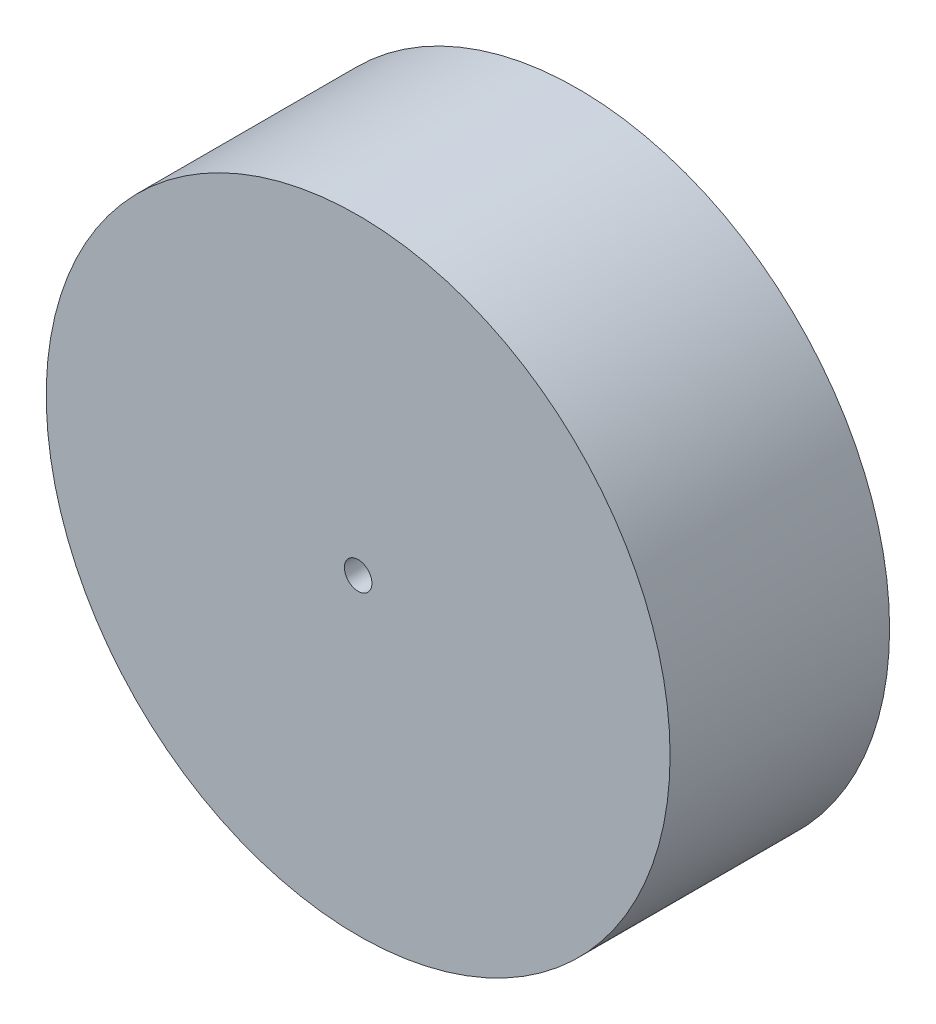
ISO-10303-21;
HEADER;
FILE_DESCRIPTION(('STEP AP214'),'2;1');
FILE_NAME('part.step','',(''),(''),'','','');
FILE_SCHEMA(('AUTOMOTIVE_DESIGN { 1 0 10303 214 1 1 1 1 }'));
ENDSEC;
DATA;
#1=APPLICATION_CONTEXT('core data for automotive mechanical design processes');
#2=APPLICATION_PROTOCOL_DEFINITION('international standard','automotive_design',2000,#1);
#3=PRODUCT_CONTEXT('',#1,'mechanical');
#4=PRODUCT('Part','Part','',(#3));
#5=PRODUCT_RELATED_PRODUCT_CATEGORY('part','',(#4));
#6=PRODUCT_DEFINITION_FORMATION('','',#4);
#7=PRODUCT_DEFINITION_CONTEXT('part definition',#1,'design');
#8=PRODUCT_DEFINITION('design','',#6,#7);
#9=PRODUCT_DEFINITION_SHAPE('','',#8);
#10=(LENGTH_UNIT() NAMED_UNIT(*) SI_UNIT(.MILLI.,.METRE.));
#11=(NAMED_UNIT(*) PLANE_ANGLE_UNIT() SI_UNIT($,.RADIAN.));
#12=(NAMED_UNIT(*) SI_UNIT($,.STERADIAN.) SOLID_ANGLE_UNIT());
#13=UNCERTAINTY_MEASURE_WITH_UNIT(LENGTH_MEASURE(1.E-05),#10,'distance_accuracy_value','');
#14=(GEOMETRIC_REPRESENTATION_CONTEXT(3) GLOBAL_UNCERTAINTY_ASSIGNED_CONTEXT((#13)) GLOBAL_UNIT_ASSIGNED_CONTEXT((#10,
#11,#12)) REPRESENTATION_CONTEXT('',''));
#15=CARTESIAN_POINT('',(0.,0.,0.));
#16=DIRECTION('',(0.,0.,1.));
#17=DIRECTION('',(1.,0.,0.));
#18=AXIS2_PLACEMENT_3D('',#15,#16,#17);
#19=CARTESIAN_POINT('',(0.,0.,38.));
#20=DIRECTION('',(0.,0.,1.));
#21=DIRECTION('',(1.,0.,0.));
#22=AXIS2_PLACEMENT_3D('',#19,#20,#21);
#23=PLANE('',#22);
#24=CARTESIAN_POINT('',(0.,0.,38.));
#25=DIRECTION('',(0.,0.,1.));
#26=DIRECTION('',(1.,0.,0.));
#27=AXIS2_PLACEMENT_3D('',#24,#25,#26);
#28=CIRCLE('',#27,54.);
#29=CARTESIAN_POINT('',(54.,0.,38.));
#30=VERTEX_POINT('',#29);
#31=EDGE_CURVE('E10',#30,#30,#28,.T.);
#32=ORIENTED_EDGE('',*,*,#31,.T.);
#33=EDGE_LOOP('',(#32));
#34=FACE_BOUND('',#33,.T.);
#35=CARTESIAN_POINT('',(0.,0.,38.));
#36=DIRECTION('',(0.,0.,1.));
#37=DIRECTION('',(1.,0.,0.));
#38=AXIS2_PLACEMENT_3D('',#35,#36,#37);
#39=CIRCLE('',#38,2.38125);
#40=CARTESIAN_POINT('',(2.38125,0.,38.));
#41=VERTEX_POINT('',#40);
#42=EDGE_CURVE('E45',#41,#41,#39,.T.);
#43=ORIENTED_EDGE('',*,*,#42,.F.);
#44=EDGE_LOOP('',(#43));
#45=FACE_BOUND('',#44,.T.);
#46=ADVANCED_FACE('F34',(#34,#45),#23,.T.);
#47=CARTESIAN_POINT('',(0.,0.,0.));
#48=DIRECTION('',(0.,0.,1.));
#49=DIRECTION('',(1.,0.,0.));
#50=AXIS2_PLACEMENT_3D('',#47,#48,#49);
#51=PLANE('',#50);
#52=CARTESIAN_POINT('',(0.,0.,0.));
#53=DIRECTION('',(0.,0.,1.));
#54=DIRECTION('',(1.,0.,0.));
#55=AXIS2_PLACEMENT_3D('',#52,#53,#54);
#56=CIRCLE('',#55,54.);
#57=CARTESIAN_POINT('',(54.,0.,0.));
#58=VERTEX_POINT('',#57);
#59=EDGE_CURVE('E38',#58,#58,#56,.T.);
#60=ORIENTED_EDGE('',*,*,#59,.F.);
#61=EDGE_LOOP('',(#60));
#62=FACE_BOUND('',#61,.T.);
#63=CARTESIAN_POINT('',(0.,0.,0.));
#64=DIRECTION('',(0.,0.,1.));
#65=DIRECTION('',(1.,0.,0.));
#66=AXIS2_PLACEMENT_3D('',#63,#64,#65);
#67=CIRCLE('',#66,2.38125);
#68=CARTESIAN_POINT('',(2.38125,0.,0.));
#69=VERTEX_POINT('',#68);
#70=EDGE_CURVE('E47',#69,#69,#67,.T.);
#71=ORIENTED_EDGE('',*,*,#70,.T.);
#72=EDGE_LOOP('',(#71));
#73=FACE_BOUND('',#72,.T.);
#74=ADVANCED_FACE('F57',(#62,#73),#51,.F.);
#75=CARTESIAN_POINT('',(0.,0.,38.));
#76=DIRECTION('',(0.,0.,-1.));
#77=DIRECTION('',(-1.,0.,0.));
#78=AXIS2_PLACEMENT_3D('',#75,#76,#77);
#79=CYLINDRICAL_SURFACE('',#78,54.);
#80=ORIENTED_EDGE('',*,*,#31,.F.);
#81=EDGE_LOOP('',(#80));
#82=FACE_BOUND('',#81,.T.);
#83=ORIENTED_EDGE('',*,*,#59,.T.);
#84=EDGE_LOOP('',(#83));
#85=FACE_BOUND('',#84,.T.);
#86=ADVANCED_FACE('F36',(#82,#85),#79,.T.);
#87=CARTESIAN_POINT('',(0.,0.,38.));
#88=DIRECTION('',(0.,0.,-1.));
#89=DIRECTION('',(-1.,0.,0.));
#90=AXIS2_PLACEMENT_3D('',#87,#88,#89);
#91=CYLINDRICAL_SURFACE('',#90,2.38125);
#92=ORIENTED_EDGE('',*,*,#42,.T.);
#93=EDGE_LOOP('',(#92));
#94=FACE_BOUND('',#93,.T.);
#95=ORIENTED_EDGE('',*,*,#70,.F.);
#96=EDGE_LOOP('',(#95));
#97=FACE_BOUND('',#96,.T.);
#98=ADVANCED_FACE('F53',(#94,#97),#91,.F.);
#99=CLOSED_SHELL('',(#46,#74,#86,#98));
#100=MANIFOLD_SOLID_BREP('B2',#99);
#101=ADVANCED_BREP_SHAPE_REPRESENTATION('',(#18,#100),#14);
#102=SHAPE_DEFINITION_REPRESENTATION(#9,#101);
ENDSEC;
END-ISO-10303-21;
